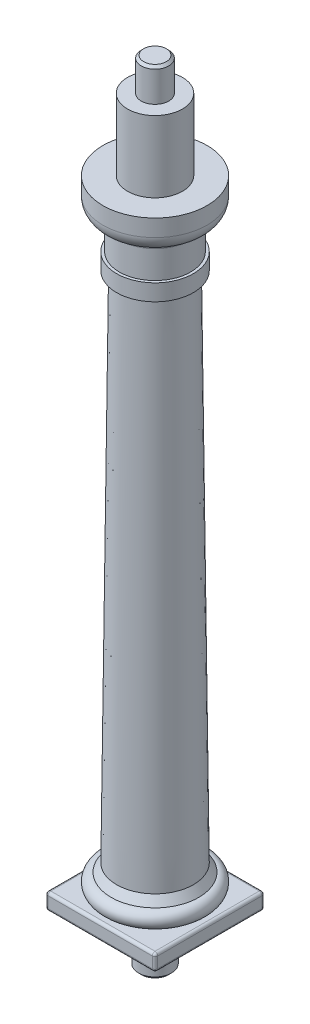
ISO-10303-21;
HEADER;
FILE_DESCRIPTION(('STEP AP214'),'2;1');
FILE_NAME('part.step','',(''),(''),'','','');
FILE_SCHEMA(('AUTOMOTIVE_DESIGN { 1 0 10303 214 1 1 1 1 }'));
ENDSEC;
DATA;
#1=APPLICATION_CONTEXT('core data for automotive mechanical design processes');
#2=APPLICATION_PROTOCOL_DEFINITION('international standard','automotive_design',2000,#1);
#3=PRODUCT_CONTEXT('',#1,'mechanical');
#4=PRODUCT('Part','Part','',(#3));
#5=PRODUCT_RELATED_PRODUCT_CATEGORY('part','',(#4));
#6=PRODUCT_DEFINITION_FORMATION('','',#4);
#7=PRODUCT_DEFINITION_CONTEXT('part definition',#1,'design');
#8=PRODUCT_DEFINITION('design','',#6,#7);
#9=PRODUCT_DEFINITION_SHAPE('','',#8);
#10=(LENGTH_UNIT() NAMED_UNIT(*) SI_UNIT(.MILLI.,.METRE.));
#11=(NAMED_UNIT(*) PLANE_ANGLE_UNIT() SI_UNIT($,.RADIAN.));
#12=(NAMED_UNIT(*) SI_UNIT($,.STERADIAN.) SOLID_ANGLE_UNIT());
#13=UNCERTAINTY_MEASURE_WITH_UNIT(LENGTH_MEASURE(1.E-05),#10,'distance_accuracy_value','');
#14=(GEOMETRIC_REPRESENTATION_CONTEXT(3) GLOBAL_UNCERTAINTY_ASSIGNED_CONTEXT((#13)) GLOBAL_UNIT_ASSIGNED_CONTEXT((#10,
#11,#12)) REPRESENTATION_CONTEXT('',''));
#15=CARTESIAN_POINT('',(0.,0.,0.));
#16=DIRECTION('',(0.,0.,1.));
#17=DIRECTION('',(1.,0.,0.));
#18=AXIS2_PLACEMENT_3D('',#15,#16,#17);
#19=CARTESIAN_POINT('',(0.,3.,0.));
#20=DIRECTION('',(0.,-1.,0.));
#21=DIRECTION('',(0.,0.,-1.));
#22=AXIS2_PLACEMENT_3D('',#19,#20,#21);
#23=PLANE('',#22);
#24=DIRECTION('',(1.,0.,0.));
#25=VECTOR('',#24,1.);
#26=CARTESIAN_POINT('',(0.,3.,9.5));
#27=LINE('',#26,#25);
#28=CARTESIAN_POINT('',(-9.5,3.,9.5));
#29=VERTEX_POINT('',#28);
#30=CARTESIAN_POINT('',(9.5,3.,9.5));
#31=VERTEX_POINT('',#30);
#32=EDGE_CURVE('E281',#29,#31,#27,.T.);
#33=ORIENTED_EDGE('',*,*,#32,.T.);
#34=DIRECTION('',(0.,0.,-1.));
#35=VECTOR('',#34,1.);
#36=CARTESIAN_POINT('',(9.5,3.,0.));
#37=LINE('',#36,#35);
#38=CARTESIAN_POINT('',(9.5,3.,-9.5));
#39=VERTEX_POINT('',#38);
#40=EDGE_CURVE('E283',#31,#39,#37,.T.);
#41=ORIENTED_EDGE('',*,*,#40,.T.);
#42=DIRECTION('',(-1.,0.,0.));
#43=VECTOR('',#42,1.);
#44=CARTESIAN_POINT('',(0.,3.,-9.5));
#45=LINE('',#44,#43);
#46=CARTESIAN_POINT('',(-9.5,3.,-9.5));
#47=VERTEX_POINT('',#46);
#48=EDGE_CURVE('E277',#39,#47,#45,.T.);
#49=ORIENTED_EDGE('',*,*,#48,.T.);
#50=DIRECTION('',(0.,0.,1.));
#51=VECTOR('',#50,1.);
#52=CARTESIAN_POINT('',(-9.5,3.,0.));
#53=LINE('',#52,#51);
#54=EDGE_CURVE('E279',#47,#29,#53,.T.);
#55=ORIENTED_EDGE('',*,*,#54,.T.);
#56=EDGE_LOOP('',(#33,#41,#49,#55));
#57=FACE_BOUND('',#56,.T.);
#58=CARTESIAN_POINT('',(0.,3.,0.));
#59=DIRECTION('',(0.,1.,0.));
#60=DIRECTION('',(0.,0.,1.));
#61=AXIS2_PLACEMENT_3D('',#58,#59,#60);
#62=CIRCLE('',#61,7.99999977705036);
#63=CARTESIAN_POINT('',(0.,3.,7.99999977705036));
#64=VERTEX_POINT('',#63);
#65=EDGE_CURVE('E261',#64,#64,#62,.T.);
#66=ORIENTED_EDGE('',*,*,#65,.F.);
#67=EDGE_LOOP('',(#66));
#68=FACE_BOUND('',#67,.T.);
#69=ADVANCED_FACE('F48',(#57,#68),#23,.F.);
#70=CARTESIAN_POINT('',(0.,0.,0.));
#71=DIRECTION('',(0.,-1.,0.));
#72=DIRECTION('',(0.,0.,-1.));
#73=AXIS2_PLACEMENT_3D('',#70,#71,#72);
#74=PLANE('',#73);
#75=DIRECTION('',(0.,0.,1.));
#76=VECTOR('',#75,1.);
#77=CARTESIAN_POINT('',(-9.5,0.,-10.));
#78=LINE('',#77,#76);
#79=CARTESIAN_POINT('',(-9.5,0.,9.5));
#80=VERTEX_POINT('',#79);
#81=CARTESIAN_POINT('',(-9.5,0.,-9.5));
#82=VERTEX_POINT('',#81);
#83=EDGE_CURVE('E268',#80,#82,#78,.F.);
#84=ORIENTED_EDGE('',*,*,#83,.T.);
#85=DIRECTION('',(-1.,0.,0.));
#86=VECTOR('',#85,1.);
#87=CARTESIAN_POINT('',(10.,0.,-9.5));
#88=LINE('',#87,#86);
#89=CARTESIAN_POINT('',(9.5,0.,-9.5));
#90=VERTEX_POINT('',#89);
#91=EDGE_CURVE('E274',#82,#90,#88,.F.);
#92=ORIENTED_EDGE('',*,*,#91,.T.);
#93=DIRECTION('',(0.,0.,-1.));
#94=VECTOR('',#93,1.);
#95=CARTESIAN_POINT('',(9.5,0.,10.));
#96=LINE('',#95,#94);
#97=CARTESIAN_POINT('',(9.5,0.,9.5));
#98=VERTEX_POINT('',#97);
#99=EDGE_CURVE('E272',#90,#98,#96,.F.);
#100=ORIENTED_EDGE('',*,*,#99,.T.);
#101=DIRECTION('',(1.,0.,0.));
#102=VECTOR('',#101,1.);
#103=CARTESIAN_POINT('',(-10.,0.,9.5));
#104=LINE('',#103,#102);
#105=EDGE_CURVE('E270',#98,#80,#104,.F.);
#106=ORIENTED_EDGE('',*,*,#105,.T.);
#107=EDGE_LOOP('',(#84,#92,#100,#106));
#108=FACE_BOUND('',#107,.T.);
#109=CARTESIAN_POINT('',(0.,0.,0.));
#110=DIRECTION('',(0.,-1.,0.));
#111=DIRECTION('',(0.,0.,-1.));
#112=AXIS2_PLACEMENT_3D('',#109,#110,#111);
#113=CIRCLE('',#112,3.);
#114=CARTESIAN_POINT('',(0.,0.,-3.));
#115=VERTEX_POINT('',#114);
#116=EDGE_CURVE('E229',#115,#115,#113,.T.);
#117=ORIENTED_EDGE('',*,*,#116,.F.);
#118=EDGE_LOOP('',(#117));
#119=FACE_BOUND('',#118,.T.);
#120=ADVANCED_FACE('F333',(#108,#119),#74,.T.);
#121=CARTESIAN_POINT('',(10.,3.,10.));
#122=DIRECTION('',(-1.,0.,0.));
#123=DIRECTION('',(0.,0.,1.));
#124=AXIS2_PLACEMENT_3D('',#121,#122,#123);
#125=PLANE('',#124);
#126=DIRECTION('',(0.,-1.,0.));
#127=VECTOR('',#126,1.);
#128=CARTESIAN_POINT('',(10.,3.,-9.5));
#129=LINE('',#128,#127);
#130=CARTESIAN_POINT('',(10.,0.5,-9.5));
#131=VERTEX_POINT('',#130);
#132=CARTESIAN_POINT('',(10.,2.5,-9.5));
#133=VERTEX_POINT('',#132);
#134=EDGE_CURVE('E290',#131,#133,#129,.F.);
#135=ORIENTED_EDGE('',*,*,#134,.T.);
#136=DIRECTION('',(0.,0.,-1.));
#137=VECTOR('',#136,1.);
#138=CARTESIAN_POINT('',(10.,2.5,10.));
#139=LINE('',#138,#137);
#140=CARTESIAN_POINT('',(10.,2.5,9.5));
#141=VERTEX_POINT('',#140);
#142=EDGE_CURVE('E292',#133,#141,#139,.F.);
#143=ORIENTED_EDGE('',*,*,#142,.T.);
#144=DIRECTION('',(0.,-1.,0.));
#145=VECTOR('',#144,1.);
#146=CARTESIAN_POINT('',(10.,3.,9.5));
#147=LINE('',#146,#145);
#148=CARTESIAN_POINT('',(10.,0.5,9.5));
#149=VERTEX_POINT('',#148);
#150=EDGE_CURVE('E286',#141,#149,#147,.T.);
#151=ORIENTED_EDGE('',*,*,#150,.T.);
#152=DIRECTION('',(0.,0.,-1.));
#153=VECTOR('',#152,1.);
#154=CARTESIAN_POINT('',(10.,0.5,-10.));
#155=LINE('',#154,#153);
#156=EDGE_CURVE('E288',#149,#131,#155,.T.);
#157=ORIENTED_EDGE('',*,*,#156,.T.);
#158=EDGE_LOOP('',(#135,#143,#151,#157));
#159=FACE_BOUND('',#158,.T.);
#160=ADVANCED_FACE('F357',(#159),#125,.F.);
#161=CARTESIAN_POINT('',(-10.,3.,-10.));
#162=DIRECTION('',(0.,0.,1.));
#163=DIRECTION('',(1.,0.,0.));
#164=AXIS2_PLACEMENT_3D('',#161,#162,#163);
#165=PLANE('',#164);
#166=DIRECTION('',(0.,-1.,0.));
#167=VECTOR('',#166,1.);
#168=CARTESIAN_POINT('',(9.5,3.,-10.));
#169=LINE('',#168,#167);
#170=CARTESIAN_POINT('',(9.5,2.5,-10.));
#171=VERTEX_POINT('',#170);
#172=CARTESIAN_POINT('',(9.5,0.5,-10.));
#173=VERTEX_POINT('',#172);
#174=EDGE_CURVE('E147',#171,#173,#169,.T.);
#175=ORIENTED_EDGE('',*,*,#174,.T.);
#176=DIRECTION('',(-1.,0.,0.));
#177=VECTOR('',#176,1.);
#178=CARTESIAN_POINT('',(-10.,0.5,-10.));
#179=LINE('',#178,#177);
#180=CARTESIAN_POINT('',(-9.5,0.5,-10.));
#181=VERTEX_POINT('',#180);
#182=EDGE_CURVE('E143',#173,#181,#179,.T.);
#183=ORIENTED_EDGE('',*,*,#182,.T.);
#184=DIRECTION('',(0.,-1.,0.));
#185=VECTOR('',#184,1.);
#186=CARTESIAN_POINT('',(-9.5,3.,-10.));
#187=LINE('',#186,#185);
#188=CARTESIAN_POINT('',(-9.5,2.5,-10.));
#189=VERTEX_POINT('',#188);
#190=EDGE_CURVE('E137',#181,#189,#187,.F.);
#191=ORIENTED_EDGE('',*,*,#190,.T.);
#192=DIRECTION('',(-1.,0.,0.));
#193=VECTOR('',#192,1.);
#194=CARTESIAN_POINT('',(-10.,2.5,-10.));
#195=LINE('',#194,#193);
#196=EDGE_CURVE('E140',#189,#171,#195,.F.);
#197=ORIENTED_EDGE('',*,*,#196,.T.);
#198=EDGE_LOOP('',(#175,#183,#191,#197));
#199=FACE_BOUND('',#198,.T.);
#200=ADVANCED_FACE('F139',(#199),#165,.F.);
#201=CARTESIAN_POINT('',(-10.,3.,10.));
#202=DIRECTION('',(1.,0.,0.));
#203=DIRECTION('',(0.,0.,-1.));
#204=AXIS2_PLACEMENT_3D('',#201,#202,#203);
#205=PLANE('',#204);
#206=DIRECTION('',(0.,0.,1.));
#207=VECTOR('',#206,1.);
#208=CARTESIAN_POINT('',(-10.,2.5,10.));
#209=LINE('',#208,#207);
#210=CARTESIAN_POINT('',(-10.,2.5,9.5));
#211=VERTEX_POINT('',#210);
#212=CARTESIAN_POINT('',(-10.,2.5,-9.5));
#213=VERTEX_POINT('',#212);
#214=EDGE_CURVE('E57',#211,#213,#209,.F.);
#215=ORIENTED_EDGE('',*,*,#214,.T.);
#216=DIRECTION('',(0.,-1.,0.));
#217=VECTOR('',#216,1.);
#218=CARTESIAN_POINT('',(-10.,3.,-9.5));
#219=LINE('',#218,#217);
#220=CARTESIAN_POINT('',(-10.,0.5,-9.5));
#221=VERTEX_POINT('',#220);
#222=EDGE_CURVE('E11',#213,#221,#219,.T.);
#223=ORIENTED_EDGE('',*,*,#222,.T.);
#224=DIRECTION('',(0.,0.,1.));
#225=VECTOR('',#224,1.);
#226=CARTESIAN_POINT('',(-10.,0.5,10.));
#227=LINE('',#226,#225);
#228=CARTESIAN_POINT('',(-10.,0.5,9.5));
#229=VERTEX_POINT('',#228);
#230=EDGE_CURVE('E304',#221,#229,#227,.T.);
#231=ORIENTED_EDGE('',*,*,#230,.T.);
#232=DIRECTION('',(0.,-1.,0.));
#233=VECTOR('',#232,1.);
#234=CARTESIAN_POINT('',(-10.,3.,9.5));
#235=LINE('',#234,#233);
#236=EDGE_CURVE('E68',#229,#211,#235,.F.);
#237=ORIENTED_EDGE('',*,*,#236,.T.);
#238=EDGE_LOOP('',(#215,#223,#231,#237));
#239=FACE_BOUND('',#238,.T.);
#240=ADVANCED_FACE('F346',(#239),#205,.F.);
#241=CARTESIAN_POINT('',(-10.,3.,10.));
#242=DIRECTION('',(0.,0.,-1.));
#243=DIRECTION('',(-1.,0.,0.));
#244=AXIS2_PLACEMENT_3D('',#241,#242,#243);
#245=PLANE('',#244);
#246=DIRECTION('',(0.,-1.,0.));
#247=VECTOR('',#246,1.);
#248=CARTESIAN_POINT('',(9.5,3.,10.));
#249=LINE('',#248,#247);
#250=CARTESIAN_POINT('',(9.5,0.5,10.));
#251=VERTEX_POINT('',#250);
#252=CARTESIAN_POINT('',(9.5,2.5,10.));
#253=VERTEX_POINT('',#252);
#254=EDGE_CURVE('E299',#251,#253,#249,.F.);
#255=ORIENTED_EDGE('',*,*,#254,.T.);
#256=DIRECTION('',(1.,0.,0.));
#257=VECTOR('',#256,1.);
#258=CARTESIAN_POINT('',(-10.,2.5,10.));
#259=LINE('',#258,#257);
#260=CARTESIAN_POINT('',(-9.5,2.5,10.));
#261=VERTEX_POINT('',#260);
#262=EDGE_CURVE('E301',#253,#261,#259,.F.);
#263=ORIENTED_EDGE('',*,*,#262,.T.);
#264=DIRECTION('',(0.,-1.,0.));
#265=VECTOR('',#264,1.);
#266=CARTESIAN_POINT('',(-9.5,3.,10.));
#267=LINE('',#266,#265);
#268=CARTESIAN_POINT('',(-9.5,0.5,10.));
#269=VERTEX_POINT('',#268);
#270=EDGE_CURVE('E295',#261,#269,#267,.T.);
#271=ORIENTED_EDGE('',*,*,#270,.T.);
#272=DIRECTION('',(1.,0.,0.));
#273=VECTOR('',#272,1.);
#274=CARTESIAN_POINT('',(10.,0.5,10.));
#275=LINE('',#274,#273);
#276=EDGE_CURVE('E297',#269,#251,#275,.T.);
#277=ORIENTED_EDGE('',*,*,#276,.T.);
#278=EDGE_LOOP('',(#255,#263,#271,#277));
#279=FACE_BOUND('',#278,.T.);
#280=ADVANCED_FACE('F348',(#279),#245,.F.);
#281=CARTESIAN_POINT('',(0.,7.5,0.));
#282=DIRECTION('',(0.,-1.,0.));
#283=DIRECTION('',(0.,0.,-1.));
#284=AXIS2_PLACEMENT_3D('',#281,#282,#283);
#285=CONICAL_SURFACE('',#284,7.,0.58800260354757);
#286=CARTESIAN_POINT('',(0.,6.,0.));
#287=DIRECTION('',(0.,1.,0.));
#288=DIRECTION('',(0.,0.,1.));
#289=AXIS2_PLACEMENT_3D('',#286,#287,#288);
#290=CIRCLE('',#289,8.);
#291=CARTESIAN_POINT('',(0.,6.,8.));
#292=VERTEX_POINT('',#291);
#293=EDGE_CURVE('E255',#292,#292,#290,.T.);
#294=ORIENTED_EDGE('',*,*,#293,.T.);
#295=EDGE_LOOP('',(#294));
#296=FACE_BOUND('',#295,.T.);
#297=CARTESIAN_POINT('',(0.,7.5,0.));
#298=DIRECTION('',(0.,1.,0.));
#299=DIRECTION('',(0.,0.,1.));
#300=AXIS2_PLACEMENT_3D('',#297,#298,#299);
#301=CIRCLE('',#300,7.);
#302=CARTESIAN_POINT('',(0.,7.5,7.));
#303=VERTEX_POINT('',#302);
#304=EDGE_CURVE('E258',#303,#303,#301,.T.);
#305=ORIENTED_EDGE('',*,*,#304,.F.);
#306=EDGE_LOOP('',(#305));
#307=FACE_BOUND('',#306,.T.);
#308=ADVANCED_FACE('F354',(#296,#307),#285,.T.);
#309=CARTESIAN_POINT('',(0.,4.5,0.));
#310=DIRECTION('',(0.,1.,0.));
#311=DIRECTION('',(0.,0.,1.));
#312=AXIS2_PLACEMENT_3D('',#309,#310,#311);
#313=TOROIDAL_SURFACE('',#312,7.99999977705036,1.50000000000001);
#314=ORIENTED_EDGE('',*,*,#65,.T.);
#315=EDGE_LOOP('',(#314));
#316=FACE_BOUND('',#315,.T.);
#317=ORIENTED_EDGE('',*,*,#293,.F.);
#318=EDGE_LOOP('',(#317));
#319=FACE_BOUND('',#318,.T.);
#320=ADVANCED_FACE('F370',(#316,#319),#313,.T.);
#321=CARTESIAN_POINT('',(0.,104.,0.));
#322=DIRECTION('',(0.,1.,0.));
#323=DIRECTION('',(0.,0.,1.));
#324=AXIS2_PLACEMENT_3D('',#321,#322,#323);
#325=PLANE('',#324);
#326=CARTESIAN_POINT('',(0.,104.,0.));
#327=DIRECTION('',(0.,1.,0.));
#328=DIRECTION('',(0.,0.,1.));
#329=AXIS2_PLACEMENT_3D('',#326,#327,#328);
#330=CIRCLE('',#329,6.50000000000001);
#331=CARTESIAN_POINT('',(0.,104.,6.50000000000001));
#332=VERTEX_POINT('',#331);
#333=EDGE_CURVE('E158',#332,#332,#330,.T.);
#334=ORIENTED_EDGE('',*,*,#333,.F.);
#335=EDGE_LOOP('',(#334));
#336=FACE_BOUND('',#335,.T.);
#337=CARTESIAN_POINT('',(0.,104.,0.));
#338=DIRECTION('',(0.,1.,0.));
#339=DIRECTION('',(0.,0.,1.));
#340=AXIS2_PLACEMENT_3D('',#337,#338,#339);
#341=CIRCLE('',#340,7.00000000000001);
#342=CARTESIAN_POINT('',(0.,104.,7.00000000000001));
#343=VERTEX_POINT('',#342);
#344=EDGE_CURVE('E252',#343,#343,#341,.T.);
#345=ORIENTED_EDGE('',*,*,#344,.T.);
#346=EDGE_LOOP('',(#345));
#347=FACE_BOUND('',#346,.T.);
#348=ADVANCED_FACE('F374',(#336,#347),#325,.T.);
#349=CARTESIAN_POINT('',(0.,134.623690834921,0.));
#350=DIRECTION('',(0.,1.,0.));
#351=DIRECTION('',(0.,0.,1.));
#352=AXIS2_PLACEMENT_3D('',#349,#350,#351);
#353=CYLINDRICAL_SURFACE('',#352,7.00000000000001);
#354=CARTESIAN_POINT('',(0.,101.,0.));
#355=DIRECTION('',(0.,1.,0.));
#356=DIRECTION('',(0.,0.,1.));
#357=AXIS2_PLACEMENT_3D('',#354,#355,#356);
#358=CIRCLE('',#357,7.00000000000001);
#359=CARTESIAN_POINT('',(0.,101.,7.00000000000001));
#360=VERTEX_POINT('',#359);
#361=EDGE_CURVE('E249',#360,#360,#358,.T.);
#362=ORIENTED_EDGE('',*,*,#361,.T.);
#363=EDGE_LOOP('',(#362));
#364=FACE_BOUND('',#363,.T.);
#365=ORIENTED_EDGE('',*,*,#344,.F.);
#366=EDGE_LOOP('',(#365));
#367=FACE_BOUND('',#366,.T.);
#368=ADVANCED_FACE('F378',(#364,#367),#353,.T.);
#369=CARTESIAN_POINT('',(0.,101.,0.));
#370=DIRECTION('',(0.,-1.,0.));
#371=DIRECTION('',(0.,0.,-1.));
#372=AXIS2_PLACEMENT_3D('',#369,#370,#371);
#373=PLANE('',#372);
#374=CARTESIAN_POINT('',(0.,101.,0.));
#375=DIRECTION('',(0.,1.,0.));
#376=DIRECTION('',(0.,0.,1.));
#377=AXIS2_PLACEMENT_3D('',#374,#375,#376);
#378=CIRCLE('',#377,6.);
#379=CARTESIAN_POINT('',(0.,101.,6.));
#380=VERTEX_POINT('',#379);
#381=EDGE_CURVE('E246',#380,#380,#378,.T.);
#382=ORIENTED_EDGE('',*,*,#381,.T.);
#383=EDGE_LOOP('',(#382));
#384=FACE_BOUND('',#383,.T.);
#385=ORIENTED_EDGE('',*,*,#361,.F.);
#386=EDGE_LOOP('',(#385));
#387=FACE_BOUND('',#386,.T.);
#388=ADVANCED_FACE('F382',(#384,#387),#373,.T.);
#389=CARTESIAN_POINT('',(0.,101.,0.));
#390=DIRECTION('',(0.,-1.,0.));
#391=DIRECTION('',(0.,0.,-1.));
#392=AXIS2_PLACEMENT_3D('',#389,#390,#391);
#393=CONICAL_SURFACE('',#392,6.,0.010694779396868);
#394=ORIENTED_EDGE('',*,*,#304,.T.);
#395=EDGE_LOOP('',(#394));
#396=FACE_BOUND('',#395,.T.);
#397=ORIENTED_EDGE('',*,*,#381,.F.);
#398=EDGE_LOOP('',(#397));
#399=FACE_BOUND('',#398,.T.);
#400=ADVANCED_FACE('F386',(#396,#399),#393,.T.);
#401=CARTESIAN_POINT('',(-2.49999999999999,129.,0.));
#402=DIRECTION('',(0.,1.,0.));
#403=DIRECTION('',(0.,0.,1.));
#404=AXIS2_PLACEMENT_3D('',#401,#402,#403);
#405=PLANE('',#404);
#406=CARTESIAN_POINT('',(0.,129.,0.));
#407=DIRECTION('',(0.,1.,0.));
#408=DIRECTION('',(0.,0.,1.));
#409=AXIS2_PLACEMENT_3D('',#406,#407,#408);
#410=CIRCLE('',#409,5.);
#411=CARTESIAN_POINT('',(0.,129.,5.));
#412=VERTEX_POINT('',#411);
#413=EDGE_CURVE('E240',#412,#412,#410,.T.);
#414=ORIENTED_EDGE('',*,*,#413,.T.);
#415=EDGE_LOOP('',(#414));
#416=FACE_BOUND('',#415,.T.);
#417=CARTESIAN_POINT('',(0.,129.,0.));
#418=DIRECTION('',(0.,1.,0.));
#419=DIRECTION('',(0.,0.,1.));
#420=AXIS2_PLACEMENT_3D('',#417,#418,#419);
#421=CIRCLE('',#420,2.49999999999999);
#422=CARTESIAN_POINT('',(0.,129.,2.49999999999999));
#423=VERTEX_POINT('',#422);
#424=EDGE_CURVE('E243',#423,#423,#421,.T.);
#425=ORIENTED_EDGE('',*,*,#424,.F.);
#426=EDGE_LOOP('',(#425));
#427=FACE_BOUND('',#426,.T.);
#428=ADVANCED_FACE('F390',(#416,#427),#405,.T.);
#429=CARTESIAN_POINT('',(0.,159.390793399037,0.));
#430=DIRECTION('',(0.,1.,0.));
#431=DIRECTION('',(0.,0.,1.));
#432=AXIS2_PLACEMENT_3D('',#429,#430,#431);
#433=CYLINDRICAL_SURFACE('',#432,5.);
#434=CARTESIAN_POINT('',(0.,116.,0.));
#435=DIRECTION('',(0.,1.,0.));
#436=DIRECTION('',(0.,0.,1.));
#437=AXIS2_PLACEMENT_3D('',#434,#435,#436);
#438=CIRCLE('',#437,5.);
#439=CARTESIAN_POINT('',(0.,116.,5.));
#440=VERTEX_POINT('',#439);
#441=EDGE_CURVE('E237',#440,#440,#438,.T.);
#442=ORIENTED_EDGE('',*,*,#441,.T.);
#443=EDGE_LOOP('',(#442));
#444=FACE_BOUND('',#443,.T.);
#445=ORIENTED_EDGE('',*,*,#413,.F.);
#446=EDGE_LOOP('',(#445));
#447=FACE_BOUND('',#446,.T.);
#448=ADVANCED_FACE('F394',(#444,#447),#433,.T.);
#449=CARTESIAN_POINT('',(-5.,116.,0.));
#450=DIRECTION('',(0.,1.,0.));
#451=DIRECTION('',(0.,0.,1.));
#452=AXIS2_PLACEMENT_3D('',#449,#450,#451);
#453=PLANE('',#452);
#454=CARTESIAN_POINT('',(0.,116.,0.));
#455=DIRECTION('',(0.,1.,0.));
#456=DIRECTION('',(0.,0.,1.));
#457=AXIS2_PLACEMENT_3D('',#454,#455,#456);
#458=CIRCLE('',#457,9.50000000000001);
#459=CARTESIAN_POINT('',(0.,116.,9.50000000000001));
#460=VERTEX_POINT('',#459);
#461=EDGE_CURVE('E234',#460,#460,#458,.T.);
#462=ORIENTED_EDGE('',*,*,#461,.T.);
#463=EDGE_LOOP('',(#462));
#464=FACE_BOUND('',#463,.T.);
#465=ORIENTED_EDGE('',*,*,#441,.F.);
#466=EDGE_LOOP('',(#465));
#467=FACE_BOUND('',#466,.T.);
#468=ADVANCED_FACE('F398',(#464,#467),#453,.T.);
#469=CARTESIAN_POINT('',(0.,159.390793399037,0.));
#470=DIRECTION('',(0.,1.,0.));
#471=DIRECTION('',(0.,0.,1.));
#472=AXIS2_PLACEMENT_3D('',#469,#470,#471);
#473=CYLINDRICAL_SURFACE('',#472,9.50000000000001);
#474=CARTESIAN_POINT('',(0.,112.904737509656,0.));
#475=DIRECTION('',(0.,1.,0.));
#476=DIRECTION('',(0.,0.,1.));
#477=AXIS2_PLACEMENT_3D('',#474,#475,#476);
#478=CIRCLE('',#477,9.50000000000001);
#479=CARTESIAN_POINT('',(0.,112.904737509656,9.50000000000001));
#480=VERTEX_POINT('',#479);
#481=EDGE_CURVE('E226',#480,#480,#478,.T.);
#482=ORIENTED_EDGE('',*,*,#481,.T.);
#483=EDGE_LOOP('',(#482));
#484=FACE_BOUND('',#483,.T.);
#485=ORIENTED_EDGE('',*,*,#461,.F.);
#486=EDGE_LOOP('',(#485));
#487=FACE_BOUND('',#486,.T.);
#488=ADVANCED_FACE('F402',(#484,#487),#473,.T.);
#489=CARTESIAN_POINT('',(0.,112.904737509656,0.));
#490=DIRECTION('',(0.,1.,0.));
#491=DIRECTION('',(0.,0.,1.));
#492=AXIS2_PLACEMENT_3D('',#489,#490,#491);
#493=TOROIDAL_SURFACE('',#492,6.50000000000001,3.);
#494=CARTESIAN_POINT('',(0.,110.,0.));
#495=DIRECTION('',(0.,1.,0.));
#496=DIRECTION('',(0.,0.,1.));
#497=AXIS2_PLACEMENT_3D('',#494,#495,#496);
#498=CIRCLE('',#497,7.25000000000001);
#499=CARTESIAN_POINT('',(0.,110.,7.25000000000001));
#500=VERTEX_POINT('',#499);
#501=EDGE_CURVE('E221',#500,#500,#498,.T.);
#502=ORIENTED_EDGE('',*,*,#501,.T.);
#503=EDGE_LOOP('',(#502));
#504=FACE_BOUND('',#503,.T.);
#505=ORIENTED_EDGE('',*,*,#481,.F.);
#506=EDGE_LOOP('',(#505));
#507=FACE_BOUND('',#506,.T.);
#508=ADVANCED_FACE('F406',(#504,#507),#493,.T.);
#509=CARTESIAN_POINT('',(0.,109.031754163448,0.));
#510=DIRECTION('',(0.,1.,0.));
#511=DIRECTION('',(0.,0.,1.));
#512=AXIS2_PLACEMENT_3D('',#509,#510,#511);
#513=TOROIDAL_SURFACE('',#512,7.50000000000001,1.);
#514=CARTESIAN_POINT('',(0.,109.031754163448,0.));
#515=DIRECTION('',(0.,1.,0.));
#516=DIRECTION('',(0.,0.,1.));
#517=AXIS2_PLACEMENT_3D('',#514,#515,#516);
#518=CIRCLE('',#517,6.5);
#519=CARTESIAN_POINT('',(0.,109.031754163448,6.5));
#520=VERTEX_POINT('',#519);
#521=EDGE_CURVE('E215',#520,#520,#518,.T.);
#522=ORIENTED_EDGE('',*,*,#521,.T.);
#523=EDGE_LOOP('',(#522));
#524=FACE_BOUND('',#523,.T.);
#525=ORIENTED_EDGE('',*,*,#501,.F.);
#526=EDGE_LOOP('',(#525));
#527=FACE_BOUND('',#526,.T.);
#528=ADVANCED_FACE('F410',(#524,#527),#513,.F.);
#529=CARTESIAN_POINT('',(0.,159.390793399037,0.));
#530=DIRECTION('',(0.,1.,0.));
#531=DIRECTION('',(0.,0.,1.));
#532=AXIS2_PLACEMENT_3D('',#529,#530,#531);
#533=CYLINDRICAL_SURFACE('',#532,6.50000000000001);
#534=ORIENTED_EDGE('',*,*,#333,.T.);
#535=EDGE_LOOP('',(#534));
#536=FACE_BOUND('',#535,.T.);
#537=ORIENTED_EDGE('',*,*,#521,.F.);
#538=EDGE_LOOP('',(#537));
#539=FACE_BOUND('',#538,.T.);
#540=ADVANCED_FACE('F414',(#536,#539),#533,.T.);
#541=CARTESIAN_POINT('',(0.,2.5,9.5));
#542=DIRECTION('',(1.,0.,0.));
#543=DIRECTION('',(0.,0.,-1.));
#544=AXIS2_PLACEMENT_3D('',#541,#542,#543);
#545=CYLINDRICAL_SURFACE('',#544,0.5);
#546=CARTESIAN_POINT('',(9.5,2.5,9.5));
#547=DIRECTION('',(1.,0.,0.));
#548=DIRECTION('',(0.,0.,-1.));
#549=AXIS2_PLACEMENT_3D('',#546,#547,#548);
#550=CIRCLE('',#549,0.5);
#551=EDGE_CURVE('E52',#31,#253,#550,.T.);
#552=ORIENTED_EDGE('',*,*,#551,.F.);
#553=ORIENTED_EDGE('',*,*,#32,.F.);
#554=CARTESIAN_POINT('',(-9.5,2.5,9.5));
#555=DIRECTION('',(-1.,0.,0.));
#556=DIRECTION('',(0.,0.,1.));
#557=AXIS2_PLACEMENT_3D('',#554,#555,#556);
#558=CIRCLE('',#557,0.5);
#559=EDGE_CURVE('E208',#261,#29,#558,.T.);
#560=ORIENTED_EDGE('',*,*,#559,.F.);
#561=ORIENTED_EDGE('',*,*,#262,.F.);
#562=EDGE_LOOP('',(#552,#553,#560,#561));
#563=FACE_BOUND('',#562,.T.);
#564=ADVANCED_FACE('F50',(#563),#545,.T.);
#565=CARTESIAN_POINT('',(9.5,2.5,9.5));
#566=DIRECTION('',(0.,0.,1.));
#567=DIRECTION('',(1.,0.,0.));
#568=AXIS2_PLACEMENT_3D('',#565,#566,#567);
#569=SPHERICAL_SURFACE('',#568,0.5);
#570=CARTESIAN_POINT('',(9.5,2.5,9.5));
#571=DIRECTION('',(0.,0.,1.));
#572=DIRECTION('',(1.,0.,0.));
#573=AXIS2_PLACEMENT_3D('',#570,#571,#572);
#574=CIRCLE('',#573,0.5);
#575=EDGE_CURVE('E203',#31,#141,#574,.F.);
#576=ORIENTED_EDGE('',*,*,#575,.F.);
#577=ORIENTED_EDGE('',*,*,#551,.T.);
#578=CARTESIAN_POINT('',(9.5,2.5,9.5));
#579=DIRECTION('',(0.,1.,0.));
#580=DIRECTION('',(0.,0.,1.));
#581=AXIS2_PLACEMENT_3D('',#578,#579,#580);
#582=CIRCLE('',#581,0.5);
#583=EDGE_CURVE('E206',#141,#253,#582,.F.);
#584=ORIENTED_EDGE('',*,*,#583,.F.);
#585=EDGE_LOOP('',(#576,#577,#584));
#586=FACE_BOUND('',#585,.T.);
#587=ADVANCED_FACE('F613',(#586),#569,.T.);
#588=CARTESIAN_POINT('',(-9.5,2.5,9.5));
#589=DIRECTION('',(0.,1.,0.));
#590=DIRECTION('',(0.,0.,1.));
#591=AXIS2_PLACEMENT_3D('',#588,#589,#590);
#592=SPHERICAL_SURFACE('',#591,0.5);
#593=CARTESIAN_POINT('',(-9.5,2.5,9.5));
#594=DIRECTION('',(0.,1.,0.));
#595=DIRECTION('',(0.,0.,1.));
#596=AXIS2_PLACEMENT_3D('',#593,#594,#595);
#597=CIRCLE('',#596,0.5);
#598=EDGE_CURVE('E198',#261,#211,#597,.F.);
#599=ORIENTED_EDGE('',*,*,#598,.F.);
#600=ORIENTED_EDGE('',*,*,#559,.T.);
#601=CARTESIAN_POINT('',(-9.5,2.5,9.5));
#602=DIRECTION('',(0.,0.,1.));
#603=DIRECTION('',(1.,0.,0.));
#604=AXIS2_PLACEMENT_3D('',#601,#602,#603);
#605=CIRCLE('',#604,0.5);
#606=EDGE_CURVE('E200',#211,#29,#605,.F.);
#607=ORIENTED_EDGE('',*,*,#606,.F.);
#608=EDGE_LOOP('',(#599,#600,#607));
#609=FACE_BOUND('',#608,.T.);
#610=ADVANCED_FACE('F605',(#609),#592,.T.);
#611=CARTESIAN_POINT('',(9.5,3.,9.5));
#612=DIRECTION('',(0.,-1.,0.));
#613=DIRECTION('',(0.,0.,-1.));
#614=AXIS2_PLACEMENT_3D('',#611,#612,#613);
#615=CYLINDRICAL_SURFACE('',#614,0.5);
#616=ORIENTED_EDGE('',*,*,#583,.T.);
#617=ORIENTED_EDGE('',*,*,#254,.F.);
#618=CARTESIAN_POINT('',(9.5,0.5,9.5));
#619=DIRECTION('',(0.,-1.,0.));
#620=DIRECTION('',(0.,0.,-1.));
#621=AXIS2_PLACEMENT_3D('',#618,#619,#620);
#622=CIRCLE('',#621,0.5);
#623=EDGE_CURVE('E192',#149,#251,#622,.T.);
#624=ORIENTED_EDGE('',*,*,#623,.F.);
#625=ORIENTED_EDGE('',*,*,#150,.F.);
#626=EDGE_LOOP('',(#616,#617,#624,#625));
#627=FACE_BOUND('',#626,.T.);
#628=ADVANCED_FACE('F597',(#627),#615,.T.);
#629=CARTESIAN_POINT('',(9.5,2.5,0.));
#630=DIRECTION('',(0.,0.,-1.));
#631=DIRECTION('',(-1.,0.,0.));
#632=AXIS2_PLACEMENT_3D('',#629,#630,#631);
#633=CYLINDRICAL_SURFACE('',#632,0.5);
#634=ORIENTED_EDGE('',*,*,#575,.T.);
#635=ORIENTED_EDGE('',*,*,#142,.F.);
#636=CARTESIAN_POINT('',(9.5,2.5,-9.5));
#637=DIRECTION('',(0.,0.,-1.));
#638=DIRECTION('',(-1.,0.,0.));
#639=AXIS2_PLACEMENT_3D('',#636,#637,#638);
#640=CIRCLE('',#639,0.5);
#641=EDGE_CURVE('E189',#39,#133,#640,.T.);
#642=ORIENTED_EDGE('',*,*,#641,.F.);
#643=ORIENTED_EDGE('',*,*,#40,.F.);
#644=EDGE_LOOP('',(#634,#635,#642,#643));
#645=FACE_BOUND('',#644,.T.);
#646=ADVANCED_FACE('F590',(#645),#633,.T.);
#647=CARTESIAN_POINT('',(0.,2.5,-9.5));
#648=DIRECTION('',(-1.,0.,0.));
#649=DIRECTION('',(0.,0.,1.));
#650=AXIS2_PLACEMENT_3D('',#647,#648,#649);
#651=CYLINDRICAL_SURFACE('',#650,0.5);
#652=CARTESIAN_POINT('',(-9.5,2.5,-9.5));
#653=DIRECTION('',(-1.,0.,0.));
#654=DIRECTION('',(0.,0.,1.));
#655=AXIS2_PLACEMENT_3D('',#652,#653,#654);
#656=CIRCLE('',#655,0.5);
#657=EDGE_CURVE('E154',#47,#189,#656,.T.);
#658=ORIENTED_EDGE('',*,*,#657,.F.);
#659=ORIENTED_EDGE('',*,*,#48,.F.);
#660=CARTESIAN_POINT('',(9.5,2.5,-9.5));
#661=DIRECTION('',(1.,0.,0.));
#662=DIRECTION('',(0.,0.,-1.));
#663=AXIS2_PLACEMENT_3D('',#660,#661,#662);
#664=CIRCLE('',#663,0.5);
#665=EDGE_CURVE('E156',#171,#39,#664,.T.);
#666=ORIENTED_EDGE('',*,*,#665,.F.);
#667=ORIENTED_EDGE('',*,*,#196,.F.);
#668=EDGE_LOOP('',(#658,#659,#666,#667));
#669=FACE_BOUND('',#668,.T.);
#670=ADVANCED_FACE('F152',(#669),#651,.T.);
#671=CARTESIAN_POINT('',(-9.5,2.5,0.));
#672=DIRECTION('',(0.,0.,1.));
#673=DIRECTION('',(1.,0.,0.));
#674=AXIS2_PLACEMENT_3D('',#671,#672,#673);
#675=CYLINDRICAL_SURFACE('',#674,0.5);
#676=ORIENTED_EDGE('',*,*,#606,.T.);
#677=ORIENTED_EDGE('',*,*,#54,.F.);
#678=CARTESIAN_POINT('',(-9.5,2.5,-9.5));
#679=DIRECTION('',(0.,0.,-1.));
#680=DIRECTION('',(-1.,0.,0.));
#681=AXIS2_PLACEMENT_3D('',#678,#679,#680);
#682=CIRCLE('',#681,0.5);
#683=EDGE_CURVE('E165',#213,#47,#682,.T.);
#684=ORIENTED_EDGE('',*,*,#683,.F.);
#685=ORIENTED_EDGE('',*,*,#214,.F.);
#686=EDGE_LOOP('',(#676,#677,#684,#685));
#687=FACE_BOUND('',#686,.T.);
#688=ADVANCED_FACE('F575',(#687),#675,.T.);
#689=CARTESIAN_POINT('',(-9.5,3.,9.5));
#690=DIRECTION('',(0.,-1.,0.));
#691=DIRECTION('',(0.,0.,-1.));
#692=AXIS2_PLACEMENT_3D('',#689,#690,#691);
#693=CYLINDRICAL_SURFACE('',#692,0.5);
#694=ORIENTED_EDGE('',*,*,#598,.T.);
#695=ORIENTED_EDGE('',*,*,#236,.F.);
#696=CARTESIAN_POINT('',(-9.5,0.5,9.5));
#697=DIRECTION('',(0.,-1.,0.));
#698=DIRECTION('',(0.,0.,-1.));
#699=AXIS2_PLACEMENT_3D('',#696,#697,#698);
#700=CIRCLE('',#699,0.5);
#701=EDGE_CURVE('E184',#269,#229,#700,.T.);
#702=ORIENTED_EDGE('',*,*,#701,.F.);
#703=ORIENTED_EDGE('',*,*,#270,.F.);
#704=EDGE_LOOP('',(#694,#695,#702,#703));
#705=FACE_BOUND('',#704,.T.);
#706=ADVANCED_FACE('F567',(#705),#693,.T.);
#707=CARTESIAN_POINT('',(-10.,0.5,9.5));
#708=DIRECTION('',(-1.,0.,0.));
#709=DIRECTION('',(0.,0.,1.));
#710=AXIS2_PLACEMENT_3D('',#707,#708,#709);
#711=CYLINDRICAL_SURFACE('',#710,0.5);
#712=CARTESIAN_POINT('',(9.5,0.5,9.5));
#713=DIRECTION('',(1.,0.,0.));
#714=DIRECTION('',(0.,0.,-1.));
#715=AXIS2_PLACEMENT_3D('',#712,#713,#714);
#716=CIRCLE('',#715,0.5);
#717=EDGE_CURVE('E195',#251,#98,#716,.T.);
#718=ORIENTED_EDGE('',*,*,#717,.F.);
#719=ORIENTED_EDGE('',*,*,#276,.F.);
#720=CARTESIAN_POINT('',(-9.5,0.5,9.5));
#721=DIRECTION('',(-1.,0.,0.));
#722=DIRECTION('',(0.,0.,1.));
#723=AXIS2_PLACEMENT_3D('',#720,#721,#722);
#724=CIRCLE('',#723,0.5);
#725=EDGE_CURVE('E181',#80,#269,#724,.T.);
#726=ORIENTED_EDGE('',*,*,#725,.F.);
#727=ORIENTED_EDGE('',*,*,#105,.F.);
#728=EDGE_LOOP('',(#718,#719,#726,#727));
#729=FACE_BOUND('',#728,.T.);
#730=ADVANCED_FACE('F559',(#729),#711,.T.);
#731=CARTESIAN_POINT('',(9.5,0.5,9.5));
#732=DIRECTION('',(0.,0.,1.));
#733=DIRECTION('',(1.,0.,0.));
#734=AXIS2_PLACEMENT_3D('',#731,#732,#733);
#735=SPHERICAL_SURFACE('',#734,0.5);
#736=ORIENTED_EDGE('',*,*,#623,.T.);
#737=ORIENTED_EDGE('',*,*,#717,.T.);
#738=CARTESIAN_POINT('',(9.5,0.5,9.5));
#739=DIRECTION('',(0.,0.,1.));
#740=DIRECTION('',(1.,0.,0.));
#741=AXIS2_PLACEMENT_3D('',#738,#739,#740);
#742=CIRCLE('',#741,0.5);
#743=EDGE_CURVE('E172',#149,#98,#742,.F.);
#744=ORIENTED_EDGE('',*,*,#743,.F.);
#745=EDGE_LOOP('',(#736,#737,#744));
#746=FACE_BOUND('',#745,.T.);
#747=ADVANCED_FACE('F551',(#746),#735,.T.);
#748=CARTESIAN_POINT('',(9.5,2.5,-9.5));
#749=DIRECTION('',(0.,1.,0.));
#750=DIRECTION('',(0.,0.,1.));
#751=AXIS2_PLACEMENT_3D('',#748,#749,#750);
#752=SPHERICAL_SURFACE('',#751,0.5);
#753=ORIENTED_EDGE('',*,*,#665,.T.);
#754=ORIENTED_EDGE('',*,*,#641,.T.);
#755=CARTESIAN_POINT('',(9.5,2.5,-9.5));
#756=DIRECTION('',(0.,1.,0.));
#757=DIRECTION('',(0.,0.,1.));
#758=AXIS2_PLACEMENT_3D('',#755,#756,#757);
#759=CIRCLE('',#758,0.5);
#760=EDGE_CURVE('E168',#171,#133,#759,.F.);
#761=ORIENTED_EDGE('',*,*,#760,.F.);
#762=EDGE_LOOP('',(#753,#754,#761));
#763=FACE_BOUND('',#762,.T.);
#764=ADVANCED_FACE('F544',(#763),#752,.T.);
#765=CARTESIAN_POINT('',(-9.5,2.5,-9.5));
#766=DIRECTION('',(0.,1.,0.));
#767=DIRECTION('',(0.,0.,1.));
#768=AXIS2_PLACEMENT_3D('',#765,#766,#767);
#769=SPHERICAL_SURFACE('',#768,0.5);
#770=ORIENTED_EDGE('',*,*,#683,.T.);
#771=ORIENTED_EDGE('',*,*,#657,.T.);
#772=CARTESIAN_POINT('',(-9.5,2.5,-9.5));
#773=DIRECTION('',(0.,1.,0.));
#774=DIRECTION('',(0.,0.,1.));
#775=AXIS2_PLACEMENT_3D('',#772,#773,#774);
#776=CIRCLE('',#775,0.5);
#777=EDGE_CURVE('E163',#213,#189,#776,.F.);
#778=ORIENTED_EDGE('',*,*,#777,.F.);
#779=EDGE_LOOP('',(#770,#771,#778));
#780=FACE_BOUND('',#779,.T.);
#781=ADVANCED_FACE('F162',(#780),#769,.T.);
#782=CARTESIAN_POINT('',(-9.5,0.5,9.5));
#783=DIRECTION('',(0.,0.,1.));
#784=DIRECTION('',(1.,0.,0.));
#785=AXIS2_PLACEMENT_3D('',#782,#783,#784);
#786=SPHERICAL_SURFACE('',#785,0.5);
#787=ORIENTED_EDGE('',*,*,#725,.T.);
#788=ORIENTED_EDGE('',*,*,#701,.T.);
#789=CARTESIAN_POINT('',(-9.5,0.5,9.5));
#790=DIRECTION('',(0.,0.,1.));
#791=DIRECTION('',(1.,0.,0.));
#792=AXIS2_PLACEMENT_3D('',#789,#790,#791);
#793=CIRCLE('',#792,0.5);
#794=EDGE_CURVE('E169',#80,#229,#793,.F.);
#795=ORIENTED_EDGE('',*,*,#794,.F.);
#796=EDGE_LOOP('',(#787,#788,#795));
#797=FACE_BOUND('',#796,.T.);
#798=ADVANCED_FACE('F530',(#797),#786,.T.);
#799=CARTESIAN_POINT('',(9.5,0.5,10.));
#800=DIRECTION('',(0.,0.,1.));
#801=DIRECTION('',(1.,0.,0.));
#802=AXIS2_PLACEMENT_3D('',#799,#800,#801);
#803=CYLINDRICAL_SURFACE('',#802,0.5);
#804=ORIENTED_EDGE('',*,*,#743,.T.);
#805=ORIENTED_EDGE('',*,*,#99,.F.);
#806=CARTESIAN_POINT('',(9.5,0.5,-9.5));
#807=DIRECTION('',(0.,0.,-1.));
#808=DIRECTION('',(-1.,0.,0.));
#809=AXIS2_PLACEMENT_3D('',#806,#807,#808);
#810=CIRCLE('',#809,0.5);
#811=EDGE_CURVE('E175',#131,#90,#810,.T.);
#812=ORIENTED_EDGE('',*,*,#811,.F.);
#813=ORIENTED_EDGE('',*,*,#156,.F.);
#814=EDGE_LOOP('',(#804,#805,#812,#813));
#815=FACE_BOUND('',#814,.T.);
#816=ADVANCED_FACE('F328',(#815),#803,.T.);
#817=CARTESIAN_POINT('',(9.5,3.,-9.5));
#818=DIRECTION('',(0.,-1.,0.));
#819=DIRECTION('',(0.,0.,-1.));
#820=AXIS2_PLACEMENT_3D('',#817,#818,#819);
#821=CYLINDRICAL_SURFACE('',#820,0.5);
#822=ORIENTED_EDGE('',*,*,#760,.T.);
#823=ORIENTED_EDGE('',*,*,#134,.F.);
#824=CARTESIAN_POINT('',(9.5,0.5,-9.5));
#825=DIRECTION('',(0.,-1.,0.));
#826=DIRECTION('',(0.,0.,-1.));
#827=AXIS2_PLACEMENT_3D('',#824,#825,#826);
#828=CIRCLE('',#827,0.5);
#829=EDGE_CURVE('E317',#173,#131,#828,.T.);
#830=ORIENTED_EDGE('',*,*,#829,.F.);
#831=ORIENTED_EDGE('',*,*,#174,.F.);
#832=EDGE_LOOP('',(#822,#823,#830,#831));
#833=FACE_BOUND('',#832,.T.);
#834=ADVANCED_FACE('F516',(#833),#821,.T.);
#835=CARTESIAN_POINT('',(-9.5,3.,-9.5));
#836=DIRECTION('',(0.,-1.,0.));
#837=DIRECTION('',(0.,0.,-1.));
#838=AXIS2_PLACEMENT_3D('',#835,#836,#837);
#839=CYLINDRICAL_SURFACE('',#838,0.5);
#840=ORIENTED_EDGE('',*,*,#777,.T.);
#841=ORIENTED_EDGE('',*,*,#190,.F.);
#842=CARTESIAN_POINT('',(-9.5,0.5,-9.5));
#843=DIRECTION('',(0.,-1.,0.));
#844=DIRECTION('',(0.,0.,-1.));
#845=AXIS2_PLACEMENT_3D('',#842,#843,#844);
#846=CIRCLE('',#845,0.5);
#847=EDGE_CURVE('E314',#221,#181,#846,.T.);
#848=ORIENTED_EDGE('',*,*,#847,.F.);
#849=ORIENTED_EDGE('',*,*,#222,.F.);
#850=EDGE_LOOP('',(#840,#841,#848,#849));
#851=FACE_BOUND('',#850,.T.);
#852=ADVANCED_FACE('F167',(#851),#839,.T.);
#853=CARTESIAN_POINT('',(-9.5,0.5,10.));
#854=DIRECTION('',(0.,0.,-1.));
#855=DIRECTION('',(-1.,0.,0.));
#856=AXIS2_PLACEMENT_3D('',#853,#854,#855);
#857=CYLINDRICAL_SURFACE('',#856,0.5);
#858=ORIENTED_EDGE('',*,*,#794,.T.);
#859=ORIENTED_EDGE('',*,*,#230,.F.);
#860=CARTESIAN_POINT('',(-9.5,0.5,-9.5));
#861=DIRECTION('',(0.,0.,-1.));
#862=DIRECTION('',(-1.,0.,0.));
#863=AXIS2_PLACEMENT_3D('',#860,#861,#862);
#864=CIRCLE('',#863,0.5);
#865=EDGE_CURVE('E312',#82,#221,#864,.T.);
#866=ORIENTED_EDGE('',*,*,#865,.F.);
#867=ORIENTED_EDGE('',*,*,#83,.F.);
#868=EDGE_LOOP('',(#858,#859,#866,#867));
#869=FACE_BOUND('',#868,.T.);
#870=ADVANCED_FACE('F344',(#869),#857,.T.);
#871=CARTESIAN_POINT('',(9.5,0.5,-9.5));
#872=DIRECTION('',(1.,0.,0.));
#873=DIRECTION('',(0.,0.,-1.));
#874=AXIS2_PLACEMENT_3D('',#871,#872,#873);
#875=SPHERICAL_SURFACE('',#874,0.5);
#876=ORIENTED_EDGE('',*,*,#829,.T.);
#877=ORIENTED_EDGE('',*,*,#811,.T.);
#878=CARTESIAN_POINT('',(9.5,0.5,-9.5));
#879=DIRECTION('',(1.,0.,0.));
#880=DIRECTION('',(0.,0.,-1.));
#881=AXIS2_PLACEMENT_3D('',#878,#879,#880);
#882=CIRCLE('',#881,0.5);
#883=EDGE_CURVE('E310',#173,#90,#882,.F.);
#884=ORIENTED_EDGE('',*,*,#883,.F.);
#885=EDGE_LOOP('',(#876,#877,#884));
#886=FACE_BOUND('',#885,.T.);
#887=ADVANCED_FACE('F324',(#886),#875,.T.);
#888=CARTESIAN_POINT('',(-9.5,0.5,-9.5));
#889=DIRECTION('',(-1.,0.,0.));
#890=DIRECTION('',(0.,0.,1.));
#891=AXIS2_PLACEMENT_3D('',#888,#889,#890);
#892=SPHERICAL_SURFACE('',#891,0.5);
#893=ORIENTED_EDGE('',*,*,#865,.T.);
#894=ORIENTED_EDGE('',*,*,#847,.T.);
#895=CARTESIAN_POINT('',(-9.5,0.5,-9.5));
#896=DIRECTION('',(-1.,0.,0.));
#897=DIRECTION('',(0.,0.,1.));
#898=AXIS2_PLACEMENT_3D('',#895,#896,#897);
#899=CIRCLE('',#898,0.5);
#900=EDGE_CURVE('E308',#82,#181,#899,.F.);
#901=ORIENTED_EDGE('',*,*,#900,.F.);
#902=EDGE_LOOP('',(#893,#894,#901));
#903=FACE_BOUND('',#902,.T.);
#904=ADVANCED_FACE('F341',(#903),#892,.T.);
#905=CARTESIAN_POINT('',(-10.,0.5,-9.5));
#906=DIRECTION('',(1.,0.,0.));
#907=DIRECTION('',(0.,0.,-1.));
#908=AXIS2_PLACEMENT_3D('',#905,#906,#907);
#909=CYLINDRICAL_SURFACE('',#908,0.5);
#910=ORIENTED_EDGE('',*,*,#883,.T.);
#911=ORIENTED_EDGE('',*,*,#91,.F.);
#912=ORIENTED_EDGE('',*,*,#900,.T.);
#913=ORIENTED_EDGE('',*,*,#182,.F.);
#914=EDGE_LOOP('',(#910,#911,#912,#913));
#915=FACE_BOUND('',#914,.T.);
#916=ADVANCED_FACE('F339',(#915),#909,.T.);
#917=CARTESIAN_POINT('',(2.4455,-9.,0.));
#918=DIRECTION('',(0.,-1.,0.));
#919=DIRECTION('',(0.,0.,-1.));
#920=AXIS2_PLACEMENT_3D('',#917,#918,#919);
#921=PLANE('',#920);
#922=CARTESIAN_POINT('',(0.,-9.,0.));
#923=DIRECTION('',(0.,1.,0.));
#924=DIRECTION('',(0.,0.,1.));
#925=AXIS2_PLACEMENT_3D('',#922,#923,#924);
#926=CIRCLE('',#925,2.4455);
#927=CARTESIAN_POINT('',(0.,-9.,2.4455));
#928=VERTEX_POINT('',#927);
#929=EDGE_CURVE('E456',#928,#928,#926,.T.);
#930=ORIENTED_EDGE('',*,*,#929,.F.);
#931=EDGE_LOOP('',(#930));
#932=FACE_BOUND('',#931,.T.);
#933=ADVANCED_FACE('F418',(#932),#921,.T.);
#934=CARTESIAN_POINT('',(0.,-8.44550000000001,0.));
#935=DIRECTION('',(0.,1.,0.));
#936=DIRECTION('',(0.,0.,1.));
#937=AXIS2_PLACEMENT_3D('',#934,#935,#936);
#938=CONICAL_SURFACE('',#937,3.,0.785398163397453);
#939=ORIENTED_EDGE('',*,*,#929,.T.);
#940=EDGE_LOOP('',(#939));
#941=FACE_BOUND('',#940,.T.);
#942=CARTESIAN_POINT('',(0.,-8.44550000000001,0.));
#943=DIRECTION('',(0.,1.,0.));
#944=DIRECTION('',(0.,0.,1.));
#945=AXIS2_PLACEMENT_3D('',#942,#943,#944);
#946=CIRCLE('',#945,3.);
#947=CARTESIAN_POINT('',(0.,-8.44550000000001,3.));
#948=VERTEX_POINT('',#947);
#949=EDGE_CURVE('E452',#948,#948,#946,.T.);
#950=ORIENTED_EDGE('',*,*,#949,.F.);
#951=EDGE_LOOP('',(#950));
#952=FACE_BOUND('',#951,.T.);
#953=ADVANCED_FACE('F421',(#941,#952),#938,.T.);
#954=CARTESIAN_POINT('',(0.,7.5,0.));
#955=DIRECTION('',(0.,1.,0.));
#956=DIRECTION('',(0.,0.,1.));
#957=AXIS2_PLACEMENT_3D('',#954,#955,#956);
#958=CYLINDRICAL_SURFACE('',#957,3.);
#959=ORIENTED_EDGE('',*,*,#116,.T.);
#960=EDGE_LOOP('',(#959));
#961=FACE_BOUND('',#960,.T.);
#962=ORIENTED_EDGE('',*,*,#949,.T.);
#963=EDGE_LOOP('',(#962));
#964=FACE_BOUND('',#963,.T.);
#965=ADVANCED_FACE('F425',(#961,#964),#958,.T.);
#966=CARTESIAN_POINT('',(2.055,135.,0.));
#967=DIRECTION('',(0.,1.,0.));
#968=DIRECTION('',(0.,0.,1.));
#969=AXIS2_PLACEMENT_3D('',#966,#967,#968);
#970=PLANE('',#969);
#971=CARTESIAN_POINT('',(0.,135.,0.));
#972=DIRECTION('',(0.,-1.,0.));
#973=DIRECTION('',(0.,0.,-1.));
#974=AXIS2_PLACEMENT_3D('',#971,#972,#973);
#975=CIRCLE('',#974,2.055);
#976=CARTESIAN_POINT('',(0.,135.,-2.055));
#977=VERTEX_POINT('',#976);
#978=EDGE_CURVE('E449',#977,#977,#975,.T.);
#979=ORIENTED_EDGE('',*,*,#978,.F.);
#980=EDGE_LOOP('',(#979));
#981=FACE_BOUND('',#980,.T.);
#982=ADVANCED_FACE('F429',(#981),#970,.T.);
#983=CARTESIAN_POINT('',(0.,134.555,0.));
#984=DIRECTION('',(0.,-1.,0.));
#985=DIRECTION('',(0.,0.,-1.));
#986=AXIS2_PLACEMENT_3D('',#983,#984,#985);
#987=CONICAL_SURFACE('',#986,2.5,0.785398163397443);
#988=ORIENTED_EDGE('',*,*,#978,.T.);
#989=EDGE_LOOP('',(#988));
#990=FACE_BOUND('',#989,.T.);
#991=CARTESIAN_POINT('',(0.,134.555,0.));
#992=DIRECTION('',(0.,-1.,0.));
#993=DIRECTION('',(0.,0.,-1.));
#994=AXIS2_PLACEMENT_3D('',#991,#992,#993);
#995=CIRCLE('',#994,2.5);
#996=CARTESIAN_POINT('',(0.,134.555,-2.5));
#997=VERTEX_POINT('',#996);
#998=EDGE_CURVE('E447',#997,#997,#995,.T.);
#999=ORIENTED_EDGE('',*,*,#998,.F.);
#1000=EDGE_LOOP('',(#999));
#1001=FACE_BOUND('',#1000,.T.);
#1002=ADVANCED_FACE('F433',(#990,#1001),#987,.T.);
#1003=CARTESIAN_POINT('',(0.,104.,0.));
#1004=DIRECTION('',(0.,-1.,0.));
#1005=DIRECTION('',(0.,0.,-1.));
#1006=AXIS2_PLACEMENT_3D('',#1003,#1004,#1005);
#1007=CYLINDRICAL_SURFACE('',#1006,2.5);
#1008=ORIENTED_EDGE('',*,*,#424,.T.);
#1009=EDGE_LOOP('',(#1008));
#1010=FACE_BOUND('',#1009,.T.);
#1011=ORIENTED_EDGE('',*,*,#998,.T.);
#1012=EDGE_LOOP('',(#1011));
#1013=FACE_BOUND('',#1012,.T.);
#1014=ADVANCED_FACE('F437',(#1010,#1013),#1007,.T.);
#1015=CLOSED_SHELL('',(#69,#120,#160,#200,#240,#280,#308,#320,#348,#368,#388,#400,#428,#448,
#468,#488,#508,#528,#540,#564,#587,#610,#628,#646,#670,#688,#706,#730,#747,#764,#781,#798,#816,
#834,#852,#870,#887,#904,#916,#933,#953,#965,#982,#1002,#1014));
#1016=MANIFOLD_SOLID_BREP('B2',#1015);
#1017=ADVANCED_BREP_SHAPE_REPRESENTATION('',(#18,#1016),#14);
#1018=SHAPE_DEFINITION_REPRESENTATION(#9,#1017);
ENDSEC;
END-ISO-10303-21;
